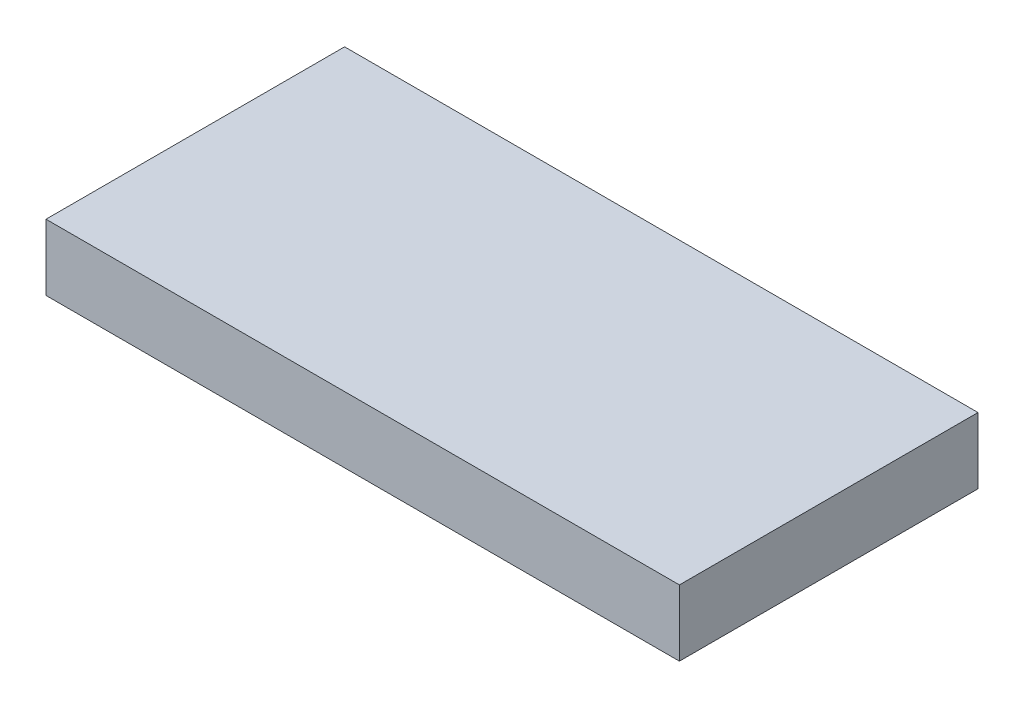
ISO-10303-21;
HEADER;
FILE_DESCRIPTION(('STEP AP214'),'2;1');
FILE_NAME('part.step','',(''),(''),'','','');
FILE_SCHEMA(('AUTOMOTIVE_DESIGN { 1 0 10303 214 1 1 1 1 }'));
ENDSEC;
DATA;
#1=APPLICATION_CONTEXT('core data for automotive mechanical design processes');
#2=APPLICATION_PROTOCOL_DEFINITION('international standard','automotive_design',2000,#1);
#3=PRODUCT_CONTEXT('',#1,'mechanical');
#4=PRODUCT('Part','Part','',(#3));
#5=PRODUCT_RELATED_PRODUCT_CATEGORY('part','',(#4));
#6=PRODUCT_DEFINITION_FORMATION('','',#4);
#7=PRODUCT_DEFINITION_CONTEXT('part definition',#1,'design');
#8=PRODUCT_DEFINITION('design','',#6,#7);
#9=PRODUCT_DEFINITION_SHAPE('','',#8);
#10=(LENGTH_UNIT() NAMED_UNIT(*) SI_UNIT(.MILLI.,.METRE.));
#11=(NAMED_UNIT(*) PLANE_ANGLE_UNIT() SI_UNIT($,.RADIAN.));
#12=(NAMED_UNIT(*) SI_UNIT($,.STERADIAN.) SOLID_ANGLE_UNIT());
#13=UNCERTAINTY_MEASURE_WITH_UNIT(LENGTH_MEASURE(1.E-05),#10,'distance_accuracy_value','');
#14=(GEOMETRIC_REPRESENTATION_CONTEXT(3) GLOBAL_UNCERTAINTY_ASSIGNED_CONTEXT((#13)) GLOBAL_UNIT_ASSIGNED_CONTEXT((#10,
#11,#12)) REPRESENTATION_CONTEXT('',''));
#15=CARTESIAN_POINT('',(0.,0.,0.));
#16=DIRECTION('',(0.,0.,1.));
#17=DIRECTION('',(1.,0.,0.));
#18=AXIS2_PLACEMENT_3D('',#15,#16,#17);
#19=CARTESIAN_POINT('',(0.,10.,0.));
#20=DIRECTION('',(1.,0.,0.));
#21=DIRECTION('',(0.,0.,-1.));
#22=AXIS2_PLACEMENT_3D('',#19,#20,#21);
#23=PLANE('',#22);
#24=DIRECTION('',(0.,0.,1.));
#25=VECTOR('',#24,1.);
#26=CARTESIAN_POINT('',(0.,0.,0.));
#27=LINE('',#26,#25);
#28=CARTESIAN_POINT('',(0.,0.,0.));
#29=VERTEX_POINT('',#28);
#30=CARTESIAN_POINT('',(0.,0.,45.1965281524889));
#31=VERTEX_POINT('',#30);
#32=EDGE_CURVE('E100',#29,#31,#27,.T.);
#33=ORIENTED_EDGE('',*,*,#32,.T.);
#34=DIRECTION('',(0.,-1.,0.));
#35=VECTOR('',#34,1.);
#36=CARTESIAN_POINT('',(0.,10.,45.1965281524889));
#37=LINE('',#36,#35);
#38=CARTESIAN_POINT('',(0.,10.,45.1965281524889));
#39=VERTEX_POINT('',#38);
#40=EDGE_CURVE('E11',#39,#31,#37,.T.);
#41=ORIENTED_EDGE('',*,*,#40,.F.);
#42=DIRECTION('',(0.,0.,1.));
#43=VECTOR('',#42,1.);
#44=CARTESIAN_POINT('',(0.,10.,0.));
#45=LINE('',#44,#43);
#46=CARTESIAN_POINT('',(0.,10.,0.));
#47=VERTEX_POINT('',#46);
#48=EDGE_CURVE('E88',#47,#39,#45,.T.);
#49=ORIENTED_EDGE('',*,*,#48,.F.);
#50=DIRECTION('',(0.,-1.,0.));
#51=VECTOR('',#50,1.);
#52=CARTESIAN_POINT('',(0.,10.,0.));
#53=LINE('',#52,#51);
#54=EDGE_CURVE('E96',#47,#29,#53,.T.);
#55=ORIENTED_EDGE('',*,*,#54,.T.);
#56=EDGE_LOOP('',(#33,#41,#49,#55));
#57=FACE_BOUND('',#56,.T.);
#58=ADVANCED_FACE('F37',(#57),#23,.F.);
#59=CARTESIAN_POINT('',(0.,10.,45.1965281524889));
#60=DIRECTION('',(0.,0.,-1.));
#61=DIRECTION('',(-1.,0.,0.));
#62=AXIS2_PLACEMENT_3D('',#59,#60,#61);
#63=PLANE('',#62);
#64=DIRECTION('',(1.,0.,0.));
#65=VECTOR('',#64,1.);
#66=CARTESIAN_POINT('',(0.,0.,45.1965281524889));
#67=LINE('',#66,#65);
#68=CARTESIAN_POINT('',(95.8786507509263,0.,45.1965281524889));
#69=VERTEX_POINT('',#68);
#70=EDGE_CURVE('E92',#31,#69,#67,.T.);
#71=ORIENTED_EDGE('',*,*,#70,.T.);
#72=DIRECTION('',(0.,-1.,0.));
#73=VECTOR('',#72,1.);
#74=CARTESIAN_POINT('',(95.8786507509263,10.,45.1965281524889));
#75=LINE('',#74,#73);
#76=CARTESIAN_POINT('',(95.8786507509263,10.,45.1965281524889));
#77=VERTEX_POINT('',#76);
#78=EDGE_CURVE('E45',#77,#69,#75,.T.);
#79=ORIENTED_EDGE('',*,*,#78,.F.);
#80=DIRECTION('',(1.,0.,0.));
#81=VECTOR('',#80,1.);
#82=CARTESIAN_POINT('',(0.,10.,45.1965281524889));
#83=LINE('',#82,#81);
#84=EDGE_CURVE('E83',#39,#77,#83,.T.);
#85=ORIENTED_EDGE('',*,*,#84,.F.);
#86=ORIENTED_EDGE('',*,*,#40,.T.);
#87=EDGE_LOOP('',(#71,#79,#85,#86));
#88=FACE_BOUND('',#87,.T.);
#89=ADVANCED_FACE('F91',(#88),#63,.F.);
#90=CARTESIAN_POINT('',(95.8786507509263,10.,0.));
#91=DIRECTION('',(-1.,0.,0.));
#92=DIRECTION('',(0.,0.,1.));
#93=AXIS2_PLACEMENT_3D('',#90,#91,#92);
#94=PLANE('',#93);
#95=DIRECTION('',(0.,0.,-1.));
#96=VECTOR('',#95,1.);
#97=CARTESIAN_POINT('',(95.8786507509263,0.,0.));
#98=LINE('',#97,#96);
#99=CARTESIAN_POINT('',(95.8786507509263,0.,0.));
#100=VERTEX_POINT('',#99);
#101=EDGE_CURVE('E70',#69,#100,#98,.T.);
#102=ORIENTED_EDGE('',*,*,#101,.T.);
#103=DIRECTION('',(0.,-1.,0.));
#104=VECTOR('',#103,1.);
#105=CARTESIAN_POINT('',(95.8786507509263,10.,0.));
#106=LINE('',#105,#104);
#107=CARTESIAN_POINT('',(95.8786507509263,10.,0.));
#108=VERTEX_POINT('',#107);
#109=EDGE_CURVE('E93',#108,#100,#106,.T.);
#110=ORIENTED_EDGE('',*,*,#109,.F.);
#111=DIRECTION('',(0.,0.,-1.));
#112=VECTOR('',#111,1.);
#113=CARTESIAN_POINT('',(95.8786507509263,10.,0.));
#114=LINE('',#113,#112);
#115=EDGE_CURVE('E86',#77,#108,#114,.T.);
#116=ORIENTED_EDGE('',*,*,#115,.F.);
#117=ORIENTED_EDGE('',*,*,#78,.T.);
#118=EDGE_LOOP('',(#102,#110,#116,#117));
#119=FACE_BOUND('',#118,.T.);
#120=ADVANCED_FACE('F94',(#119),#94,.F.);
#121=CARTESIAN_POINT('',(0.,10.,0.));
#122=DIRECTION('',(0.,0.,1.));
#123=DIRECTION('',(1.,0.,0.));
#124=AXIS2_PLACEMENT_3D('',#121,#122,#123);
#125=PLANE('',#124);
#126=DIRECTION('',(-1.,0.,0.));
#127=VECTOR('',#126,1.);
#128=CARTESIAN_POINT('',(0.,0.,0.));
#129=LINE('',#128,#127);
#130=EDGE_CURVE('E76',#100,#29,#129,.T.);
#131=ORIENTED_EDGE('',*,*,#130,.T.);
#132=ORIENTED_EDGE('',*,*,#54,.F.);
#133=DIRECTION('',(-1.,0.,0.));
#134=VECTOR('',#133,1.);
#135=CARTESIAN_POINT('',(0.,10.,0.));
#136=LINE('',#135,#134);
#137=EDGE_CURVE('E53',#108,#47,#136,.T.);
#138=ORIENTED_EDGE('',*,*,#137,.F.);
#139=ORIENTED_EDGE('',*,*,#109,.T.);
#140=EDGE_LOOP('',(#131,#132,#138,#139));
#141=FACE_BOUND('',#140,.T.);
#142=ADVANCED_FACE('F107',(#141),#125,.F.);
#143=CARTESIAN_POINT('',(0.,10.,0.));
#144=DIRECTION('',(0.,1.,0.));
#145=DIRECTION('',(0.,0.,1.));
#146=AXIS2_PLACEMENT_3D('',#143,#144,#145);
#147=PLANE('',#146);
#148=ORIENTED_EDGE('',*,*,#48,.T.);
#149=ORIENTED_EDGE('',*,*,#84,.T.);
#150=ORIENTED_EDGE('',*,*,#115,.T.);
#151=ORIENTED_EDGE('',*,*,#137,.T.);
#152=EDGE_LOOP('',(#148,#149,#150,#151));
#153=FACE_BOUND('',#152,.T.);
#154=ADVANCED_FACE('F84',(#153),#147,.T.);
#155=CARTESIAN_POINT('',(0.,0.,0.));
#156=DIRECTION('',(0.,1.,0.));
#157=DIRECTION('',(0.,0.,1.));
#158=AXIS2_PLACEMENT_3D('',#155,#156,#157);
#159=PLANE('',#158);
#160=ORIENTED_EDGE('',*,*,#32,.F.);
#161=ORIENTED_EDGE('',*,*,#130,.F.);
#162=ORIENTED_EDGE('',*,*,#101,.F.);
#163=ORIENTED_EDGE('',*,*,#70,.F.);
#164=EDGE_LOOP('',(#160,#161,#162,#163));
#165=FACE_BOUND('',#164,.T.);
#166=ADVANCED_FACE('F110',(#165),#159,.F.);
#167=CLOSED_SHELL('',(#58,#89,#120,#142,#154,#166));
#168=MANIFOLD_SOLID_BREP('B2',#167);
#169=ADVANCED_BREP_SHAPE_REPRESENTATION('',(#18,#168),#14);
#170=SHAPE_DEFINITION_REPRESENTATION(#9,#169);
ENDSEC;
END-ISO-10303-21;
